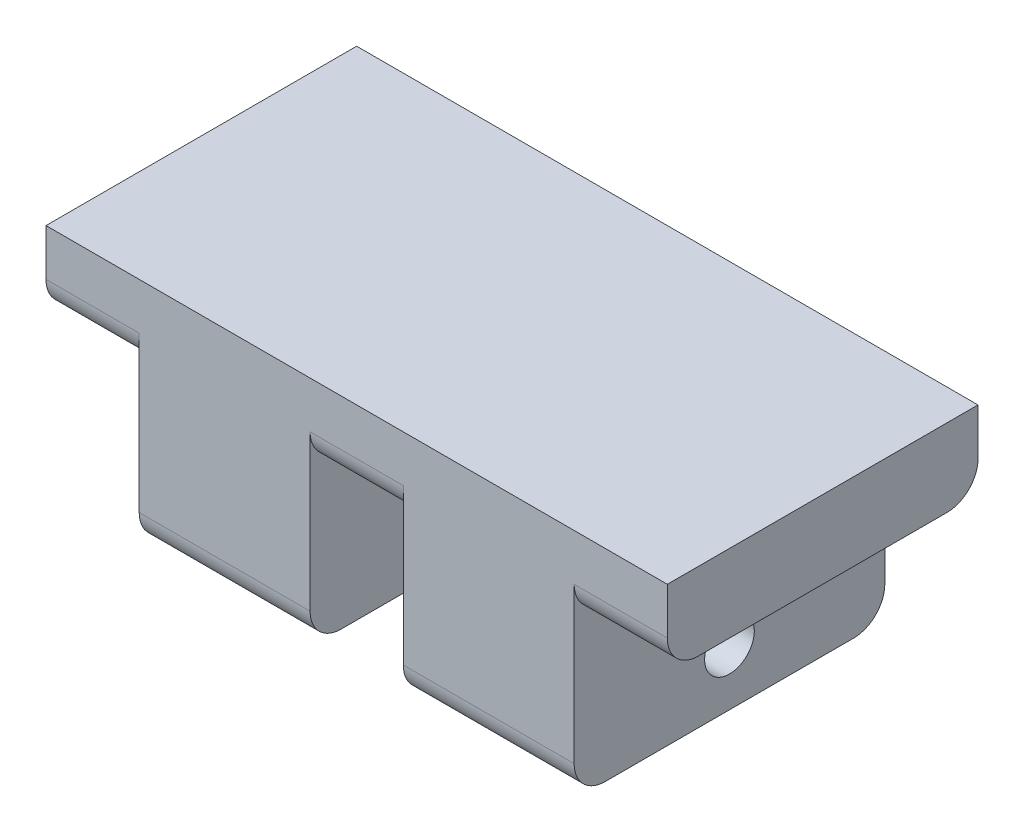
ISO-10303-21;
HEADER;
FILE_DESCRIPTION(('STEP AP214'),'2;1');
FILE_NAME('part.step','',(''),(''),'','','');
FILE_SCHEMA(('AUTOMOTIVE_DESIGN { 1 0 10303 214 1 1 1 1 }'));
ENDSEC;
DATA;
#1=APPLICATION_CONTEXT('core data for automotive mechanical design processes');
#2=APPLICATION_PROTOCOL_DEFINITION('international standard','automotive_design',2000,#1);
#3=PRODUCT_CONTEXT('',#1,'mechanical');
#4=PRODUCT('Part','Part','',(#3));
#5=PRODUCT_RELATED_PRODUCT_CATEGORY('part','',(#4));
#6=PRODUCT_DEFINITION_FORMATION('','',#4);
#7=PRODUCT_DEFINITION_CONTEXT('part definition',#1,'design');
#8=PRODUCT_DEFINITION('design','',#6,#7);
#9=PRODUCT_DEFINITION_SHAPE('','',#8);
#10=(LENGTH_UNIT() NAMED_UNIT(*) SI_UNIT(.MILLI.,.METRE.));
#11=(NAMED_UNIT(*) PLANE_ANGLE_UNIT() SI_UNIT($,.RADIAN.));
#12=(NAMED_UNIT(*) SI_UNIT($,.STERADIAN.) SOLID_ANGLE_UNIT());
#13=UNCERTAINTY_MEASURE_WITH_UNIT(LENGTH_MEASURE(1.E-05),#10,'distance_accuracy_value','');
#14=(GEOMETRIC_REPRESENTATION_CONTEXT(3) GLOBAL_UNCERTAINTY_ASSIGNED_CONTEXT((#13)) GLOBAL_UNIT_ASSIGNED_CONTEXT((#10,
#11,#12)) REPRESENTATION_CONTEXT('',''));
#15=CARTESIAN_POINT('',(0.,0.,0.));
#16=DIRECTION('',(0.,0.,1.));
#17=DIRECTION('',(1.,0.,0.));
#18=AXIS2_PLACEMENT_3D('',#15,#16,#17);
#19=CARTESIAN_POINT('',(13.97,0.,25.4));
#20=DIRECTION('',(0.,1.,0.));
#21=DIRECTION('',(-1.,0.,0.));
#22=AXIS2_PLACEMENT_3D('',#19,#20,#21);
#23=PLANE('',#22);
#24=DIRECTION('',(0.,0.,-1.));
#25=VECTOR('',#24,1.);
#26=CARTESIAN_POINT('',(0.,0.,25.4));
#27=LINE('',#26,#25);
#28=CARTESIAN_POINT('',(0.,0.,22.86));
#29=VERTEX_POINT('',#28);
#30=CARTESIAN_POINT('',(0.,0.,2.54));
#31=VERTEX_POINT('',#30);
#32=EDGE_CURVE('E213',#29,#31,#27,.T.);
#33=ORIENTED_EDGE('',*,*,#32,.T.);
#34=DIRECTION('',(1.,0.,0.));
#35=VECTOR('',#34,1.);
#36=CARTESIAN_POINT('',(13.97,0.,2.54));
#37=LINE('',#36,#35);
#38=CARTESIAN_POINT('',(13.97,0.,2.54));
#39=VERTEX_POINT('',#38);
#40=EDGE_CURVE('E262',#31,#39,#37,.T.);
#41=ORIENTED_EDGE('',*,*,#40,.T.);
#42=DIRECTION('',(0.,0.,-1.));
#43=VECTOR('',#42,1.);
#44=CARTESIAN_POINT('',(13.97,0.,25.4));
#45=LINE('',#44,#43);
#46=CARTESIAN_POINT('',(13.97,0.,22.86));
#47=VERTEX_POINT('',#46);
#48=EDGE_CURVE('E257',#47,#39,#45,.T.);
#49=ORIENTED_EDGE('',*,*,#48,.F.);
#50=DIRECTION('',(1.,0.,0.));
#51=VECTOR('',#50,1.);
#52=CARTESIAN_POINT('',(13.97,0.,22.86));
#53=LINE('',#52,#51);
#54=EDGE_CURVE('E260',#47,#29,#53,.F.);
#55=ORIENTED_EDGE('',*,*,#54,.T.);
#56=EDGE_LOOP('',(#33,#41,#49,#55));
#57=FACE_BOUND('',#56,.T.);
#58=ADVANCED_FACE('F32',(#57),#23,.F.);
#59=CARTESIAN_POINT('',(13.97,12.7,25.4));
#60=DIRECTION('',(-1.,0.,0.));
#61=DIRECTION('',(0.,-1.,0.));
#62=AXIS2_PLACEMENT_3D('',#59,#60,#61);
#63=PLANE('',#62);
#64=CARTESIAN_POINT('',(13.97,4.572,12.7));
#65=DIRECTION('',(-1.,0.,0.));
#66=DIRECTION('',(0.,-1.,0.));
#67=AXIS2_PLACEMENT_3D('',#64,#65,#66);
#68=CIRCLE('',#67,2.03199999999998);
#69=CARTESIAN_POINT('',(13.97,2.54000000000002,12.7));
#70=VERTEX_POINT('',#69);
#71=EDGE_CURVE('E217',#70,#70,#68,.T.);
#72=ORIENTED_EDGE('',*,*,#71,.T.);
#73=EDGE_LOOP('',(#72));
#74=FACE_BOUND('',#73,.T.);
#75=ORIENTED_EDGE('',*,*,#48,.T.);
#76=CARTESIAN_POINT('',(13.97,2.54,2.54));
#77=DIRECTION('',(-1.,0.,0.));
#78=DIRECTION('',(0.,-1.,0.));
#79=AXIS2_PLACEMENT_3D('',#76,#77,#78);
#80=CIRCLE('',#79,2.54);
#81=CARTESIAN_POINT('',(13.97,2.54,0.));
#82=VERTEX_POINT('',#81);
#83=EDGE_CURVE('E267',#39,#82,#80,.F.);
#84=ORIENTED_EDGE('',*,*,#83,.T.);
#85=DIRECTION('',(0.,1.,0.));
#86=VECTOR('',#85,1.);
#87=CARTESIAN_POINT('',(13.97,12.7,0.));
#88=LINE('',#87,#86);
#89=CARTESIAN_POINT('',(13.97,15.24,0.));
#90=VERTEX_POINT('',#89);
#91=EDGE_CURVE('E214',#82,#90,#88,.T.);
#92=ORIENTED_EDGE('',*,*,#91,.T.);
#93=CARTESIAN_POINT('',(13.97,15.24,2.54));
#94=DIRECTION('',(-1.,0.,0.));
#95=DIRECTION('',(0.,-1.,0.));
#96=AXIS2_PLACEMENT_3D('',#93,#94,#95);
#97=CIRCLE('',#96,2.54);
#98=CARTESIAN_POINT('',(13.97,12.7,2.54));
#99=VERTEX_POINT('',#98);
#100=EDGE_CURVE('E344',#90,#99,#97,.T.);
#101=ORIENTED_EDGE('',*,*,#100,.T.);
#102=DIRECTION('',(0.,0.,-1.));
#103=VECTOR('',#102,1.);
#104=CARTESIAN_POINT('',(13.97,12.7,25.4));
#105=LINE('',#104,#103);
#106=CARTESIAN_POINT('',(13.97,12.7,22.86));
#107=VERTEX_POINT('',#106);
#108=EDGE_CURVE('E254',#107,#99,#105,.T.);
#109=ORIENTED_EDGE('',*,*,#108,.F.);
#110=CARTESIAN_POINT('',(13.97,15.24,22.86));
#111=DIRECTION('',(-1.,0.,0.));
#112=DIRECTION('',(0.,-1.,0.));
#113=AXIS2_PLACEMENT_3D('',#110,#111,#112);
#114=CIRCLE('',#113,2.54);
#115=CARTESIAN_POINT('',(13.97,15.24,25.4));
#116=VERTEX_POINT('',#115);
#117=EDGE_CURVE('E40',#107,#116,#114,.T.);
#118=ORIENTED_EDGE('',*,*,#117,.T.);
#119=DIRECTION('',(0.,1.,0.));
#120=VECTOR('',#119,1.);
#121=CARTESIAN_POINT('',(13.97,12.7,25.4));
#122=LINE('',#121,#120);
#123=CARTESIAN_POINT('',(13.97,2.54,25.4));
#124=VERTEX_POINT('',#123);
#125=EDGE_CURVE('E231',#124,#116,#122,.T.);
#126=ORIENTED_EDGE('',*,*,#125,.F.);
#127=CARTESIAN_POINT('',(13.97,2.54,22.86));
#128=DIRECTION('',(-1.,0.,0.));
#129=DIRECTION('',(0.,-1.,0.));
#130=AXIS2_PLACEMENT_3D('',#127,#128,#129);
#131=CIRCLE('',#130,2.54);
#132=EDGE_CURVE('E265',#124,#47,#131,.F.);
#133=ORIENTED_EDGE('',*,*,#132,.T.);
#134=EDGE_LOOP('',(#75,#84,#92,#101,#109,#118,#126,#133));
#135=FACE_BOUND('',#134,.T.);
#136=ADVANCED_FACE('F357',(#74,#135),#63,.F.);
#137=CARTESIAN_POINT('',(21.59,12.7,25.4));
#138=DIRECTION('',(0.,1.,0.));
#139=DIRECTION('',(-1.,0.,0.));
#140=AXIS2_PLACEMENT_3D('',#137,#138,#139);
#141=PLANE('',#140);
#142=ORIENTED_EDGE('',*,*,#108,.T.);
#143=DIRECTION('',(1.,0.,0.));
#144=VECTOR('',#143,1.);
#145=CARTESIAN_POINT('',(21.59,12.7,2.54));
#146=LINE('',#145,#144);
#147=CARTESIAN_POINT('',(21.59,12.7,2.54));
#148=VERTEX_POINT('',#147);
#149=EDGE_CURVE('E319',#99,#148,#146,.T.);
#150=ORIENTED_EDGE('',*,*,#149,.T.);
#151=DIRECTION('',(0.,0.,-1.));
#152=VECTOR('',#151,1.);
#153=CARTESIAN_POINT('',(21.59,12.7,25.4));
#154=LINE('',#153,#152);
#155=CARTESIAN_POINT('',(21.59,12.7,22.86));
#156=VERTEX_POINT('',#155);
#157=EDGE_CURVE('E251',#156,#148,#154,.T.);
#158=ORIENTED_EDGE('',*,*,#157,.F.);
#159=DIRECTION('',(1.,0.,0.));
#160=VECTOR('',#159,1.);
#161=CARTESIAN_POINT('',(21.59,12.7,22.86));
#162=LINE('',#161,#160);
#163=EDGE_CURVE('E317',#156,#107,#162,.F.);
#164=ORIENTED_EDGE('',*,*,#163,.T.);
#165=EDGE_LOOP('',(#142,#150,#158,#164));
#166=FACE_BOUND('',#165,.T.);
#167=ADVANCED_FACE('F449',(#166),#141,.F.);
#168=CARTESIAN_POINT('',(21.59,0.,25.4));
#169=DIRECTION('',(1.,0.,0.));
#170=DIRECTION('',(0.,0.,-1.));
#171=AXIS2_PLACEMENT_3D('',#168,#169,#170);
#172=PLANE('',#171);
#173=CARTESIAN_POINT('',(21.59,4.572,12.7));
#174=DIRECTION('',(1.,0.,0.));
#175=DIRECTION('',(0.,0.,-1.));
#176=AXIS2_PLACEMENT_3D('',#173,#174,#175);
#177=CIRCLE('',#176,2.03199999999998);
#178=CARTESIAN_POINT('',(21.59,4.572,10.668));
#179=VERTEX_POINT('',#178);
#180=EDGE_CURVE('E299',#179,#179,#177,.T.);
#181=ORIENTED_EDGE('',*,*,#180,.T.);
#182=EDGE_LOOP('',(#181));
#183=FACE_BOUND('',#182,.T.);
#184=DIRECTION('',(0.,-1.,0.));
#185=VECTOR('',#184,1.);
#186=CARTESIAN_POINT('',(21.59,0.,0.));
#187=LINE('',#186,#185);
#188=CARTESIAN_POINT('',(21.59,15.24,0.));
#189=VERTEX_POINT('',#188);
#190=CARTESIAN_POINT('',(21.59,2.54,0.));
#191=VERTEX_POINT('',#190);
#192=EDGE_CURVE('E216',#189,#191,#187,.T.);
#193=ORIENTED_EDGE('',*,*,#192,.T.);
#194=CARTESIAN_POINT('',(21.59,2.54,2.54));
#195=DIRECTION('',(1.,0.,0.));
#196=DIRECTION('',(0.,0.,-1.));
#197=AXIS2_PLACEMENT_3D('',#194,#195,#196);
#198=CIRCLE('',#197,2.54);
#199=CARTESIAN_POINT('',(21.59,0.,2.54));
#200=VERTEX_POINT('',#199);
#201=EDGE_CURVE('E288',#191,#200,#198,.F.);
#202=ORIENTED_EDGE('',*,*,#201,.T.);
#203=DIRECTION('',(0.,0.,-1.));
#204=VECTOR('',#203,1.);
#205=CARTESIAN_POINT('',(21.59,0.,25.4));
#206=LINE('',#205,#204);
#207=CARTESIAN_POINT('',(21.59,0.,22.86));
#208=VERTEX_POINT('',#207);
#209=EDGE_CURVE('E248',#208,#200,#206,.T.);
#210=ORIENTED_EDGE('',*,*,#209,.F.);
#211=CARTESIAN_POINT('',(21.59,2.54,22.86));
#212=DIRECTION('',(1.,0.,0.));
#213=DIRECTION('',(0.,0.,-1.));
#214=AXIS2_PLACEMENT_3D('',#211,#212,#213);
#215=CIRCLE('',#214,2.54);
#216=CARTESIAN_POINT('',(21.59,2.54,25.4));
#217=VERTEX_POINT('',#216);
#218=EDGE_CURVE('E286',#208,#217,#215,.F.);
#219=ORIENTED_EDGE('',*,*,#218,.T.);
#220=DIRECTION('',(0.,-1.,0.));
#221=VECTOR('',#220,1.);
#222=CARTESIAN_POINT('',(21.59,0.,25.4));
#223=LINE('',#222,#221);
#224=CARTESIAN_POINT('',(21.59,15.24,25.4));
#225=VERTEX_POINT('',#224);
#226=EDGE_CURVE('E55',#225,#217,#223,.T.);
#227=ORIENTED_EDGE('',*,*,#226,.F.);
#228=CARTESIAN_POINT('',(21.59,15.24,22.86));
#229=DIRECTION('',(1.,0.,0.));
#230=DIRECTION('',(0.,0.,-1.));
#231=AXIS2_PLACEMENT_3D('',#228,#229,#230);
#232=CIRCLE('',#231,2.54);
#233=EDGE_CURVE('E350',#225,#156,#232,.T.);
#234=ORIENTED_EDGE('',*,*,#233,.T.);
#235=ORIENTED_EDGE('',*,*,#157,.T.);
#236=CARTESIAN_POINT('',(21.59,15.24,2.54));
#237=DIRECTION('',(1.,0.,0.));
#238=DIRECTION('',(0.,0.,-1.));
#239=AXIS2_PLACEMENT_3D('',#236,#237,#238);
#240=CIRCLE('',#239,2.54);
#241=EDGE_CURVE('E341',#148,#189,#240,.T.);
#242=ORIENTED_EDGE('',*,*,#241,.T.);
#243=EDGE_LOOP('',(#193,#202,#210,#219,#227,#234,#235,#242));
#244=FACE_BOUND('',#243,.T.);
#245=ADVANCED_FACE('F391',(#183,#244),#172,.F.);
#246=CARTESIAN_POINT('',(35.56,0.,25.4));
#247=DIRECTION('',(0.,1.,0.));
#248=DIRECTION('',(-1.,0.,0.));
#249=AXIS2_PLACEMENT_3D('',#246,#247,#248);
#250=PLANE('',#249);
#251=ORIENTED_EDGE('',*,*,#209,.T.);
#252=DIRECTION('',(1.,0.,0.));
#253=VECTOR('',#252,1.);
#254=CARTESIAN_POINT('',(35.56,0.,2.54));
#255=LINE('',#254,#253);
#256=CARTESIAN_POINT('',(35.56,0.,2.54));
#257=VERTEX_POINT('',#256);
#258=EDGE_CURVE('E279',#200,#257,#255,.T.);
#259=ORIENTED_EDGE('',*,*,#258,.T.);
#260=DIRECTION('',(0.,0.,-1.));
#261=VECTOR('',#260,1.);
#262=CARTESIAN_POINT('',(35.56,0.,25.4));
#263=LINE('',#262,#261);
#264=CARTESIAN_POINT('',(35.56,0.,22.86));
#265=VERTEX_POINT('',#264);
#266=EDGE_CURVE('E245',#265,#257,#263,.T.);
#267=ORIENTED_EDGE('',*,*,#266,.F.);
#268=DIRECTION('',(1.,0.,0.));
#269=VECTOR('',#268,1.);
#270=CARTESIAN_POINT('',(35.56,0.,22.86));
#271=LINE('',#270,#269);
#272=EDGE_CURVE('E277',#265,#208,#271,.F.);
#273=ORIENTED_EDGE('',*,*,#272,.T.);
#274=EDGE_LOOP('',(#251,#259,#267,#273));
#275=FACE_BOUND('',#274,.T.);
#276=ADVANCED_FACE('F380',(#275),#250,.F.);
#277=CARTESIAN_POINT('',(35.56,12.7,25.4));
#278=DIRECTION('',(-1.,0.,0.));
#279=DIRECTION('',(0.,0.,1.));
#280=AXIS2_PLACEMENT_3D('',#277,#278,#279);
#281=PLANE('',#280);
#282=CARTESIAN_POINT('',(35.56,4.572,12.7));
#283=DIRECTION('',(1.,0.,0.));
#284=DIRECTION('',(0.,0.,-1.));
#285=AXIS2_PLACEMENT_3D('',#282,#283,#284);
#286=CIRCLE('',#285,2.03199999999998);
#287=CARTESIAN_POINT('',(35.56,4.572,10.668));
#288=VERTEX_POINT('',#287);
#289=EDGE_CURVE('E300',#288,#288,#286,.T.);
#290=ORIENTED_EDGE('',*,*,#289,.F.);
#291=EDGE_LOOP('',(#290));
#292=FACE_BOUND('',#291,.T.);
#293=ORIENTED_EDGE('',*,*,#266,.T.);
#294=CARTESIAN_POINT('',(35.56,2.54,2.54));
#295=DIRECTION('',(-1.,0.,0.));
#296=DIRECTION('',(0.,0.,1.));
#297=AXIS2_PLACEMENT_3D('',#294,#295,#296);
#298=CIRCLE('',#297,2.54);
#299=CARTESIAN_POINT('',(35.56,2.54,0.));
#300=VERTEX_POINT('',#299);
#301=EDGE_CURVE('E284',#257,#300,#298,.F.);
#302=ORIENTED_EDGE('',*,*,#301,.T.);
#303=DIRECTION('',(0.,1.,0.));
#304=VECTOR('',#303,1.);
#305=CARTESIAN_POINT('',(35.56,12.7,0.));
#306=LINE('',#305,#304);
#307=CARTESIAN_POINT('',(35.56,15.24,0.));
#308=VERTEX_POINT('',#307);
#309=EDGE_CURVE('E220',#300,#308,#306,.T.);
#310=ORIENTED_EDGE('',*,*,#309,.T.);
#311=CARTESIAN_POINT('',(35.56,15.24,2.54));
#312=DIRECTION('',(-1.,0.,0.));
#313=DIRECTION('',(0.,0.,1.));
#314=AXIS2_PLACEMENT_3D('',#311,#312,#313);
#315=CIRCLE('',#314,2.54);
#316=CARTESIAN_POINT('',(35.56,12.7,2.54));
#317=VERTEX_POINT('',#316);
#318=EDGE_CURVE('E346',#308,#317,#315,.T.);
#319=ORIENTED_EDGE('',*,*,#318,.T.);
#320=DIRECTION('',(0.,0.,-1.));
#321=VECTOR('',#320,1.);
#322=CARTESIAN_POINT('',(35.56,12.7,25.4));
#323=LINE('',#322,#321);
#324=CARTESIAN_POINT('',(35.56,12.7,22.86));
#325=VERTEX_POINT('',#324);
#326=EDGE_CURVE('E242',#325,#317,#323,.T.);
#327=ORIENTED_EDGE('',*,*,#326,.F.);
#328=CARTESIAN_POINT('',(35.56,15.24,22.86));
#329=DIRECTION('',(-1.,0.,0.));
#330=DIRECTION('',(0.,0.,1.));
#331=AXIS2_PLACEMENT_3D('',#328,#329,#330);
#332=CIRCLE('',#331,2.54);
#333=CARTESIAN_POINT('',(35.56,15.24,25.4));
#334=VERTEX_POINT('',#333);
#335=EDGE_CURVE('E348',#325,#334,#332,.T.);
#336=ORIENTED_EDGE('',*,*,#335,.T.);
#337=DIRECTION('',(0.,1.,0.));
#338=VECTOR('',#337,1.);
#339=CARTESIAN_POINT('',(35.56,12.7,25.4));
#340=LINE('',#339,#338);
#341=CARTESIAN_POINT('',(35.56,2.54,25.4));
#342=VERTEX_POINT('',#341);
#343=EDGE_CURVE('E47',#342,#334,#340,.T.);
#344=ORIENTED_EDGE('',*,*,#343,.F.);
#345=CARTESIAN_POINT('',(35.56,2.54,22.86));
#346=DIRECTION('',(-1.,0.,0.));
#347=DIRECTION('',(0.,0.,1.));
#348=AXIS2_PLACEMENT_3D('',#345,#346,#347);
#349=CIRCLE('',#348,2.54);
#350=EDGE_CURVE('E282',#342,#265,#349,.F.);
#351=ORIENTED_EDGE('',*,*,#350,.T.);
#352=EDGE_LOOP('',(#293,#302,#310,#319,#327,#336,#344,#351));
#353=FACE_BOUND('',#352,.T.);
#354=ADVANCED_FACE('F376',(#292,#353),#281,.F.);
#355=CARTESIAN_POINT('',(43.18,12.7,25.4));
#356=DIRECTION('',(0.,1.,0.));
#357=DIRECTION('',(-1.,0.,0.));
#358=AXIS2_PLACEMENT_3D('',#355,#356,#357);
#359=PLANE('',#358);
#360=ORIENTED_EDGE('',*,*,#326,.T.);
#361=DIRECTION('',(1.,0.,0.));
#362=VECTOR('',#361,1.);
#363=CARTESIAN_POINT('',(43.18,12.7,2.54));
#364=LINE('',#363,#362);
#365=CARTESIAN_POINT('',(43.18,12.7,2.54));
#366=VERTEX_POINT('',#365);
#367=EDGE_CURVE('E324',#317,#366,#364,.T.);
#368=ORIENTED_EDGE('',*,*,#367,.T.);
#369=DIRECTION('',(0.,0.,-1.));
#370=VECTOR('',#369,1.);
#371=CARTESIAN_POINT('',(43.18,12.7,25.4));
#372=LINE('',#371,#370);
#373=CARTESIAN_POINT('',(43.18,12.7,22.86));
#374=VERTEX_POINT('',#373);
#375=EDGE_CURVE('E199',#374,#366,#372,.T.);
#376=ORIENTED_EDGE('',*,*,#375,.F.);
#377=DIRECTION('',(1.,0.,0.));
#378=VECTOR('',#377,1.);
#379=CARTESIAN_POINT('',(43.18,12.7,22.86));
#380=LINE('',#379,#378);
#381=EDGE_CURVE('E322',#374,#325,#380,.F.);
#382=ORIENTED_EDGE('',*,*,#381,.T.);
#383=EDGE_LOOP('',(#360,#368,#376,#382));
#384=FACE_BOUND('',#383,.T.);
#385=ADVANCED_FACE('F379',(#384),#359,.F.);
#386=CARTESIAN_POINT('',(43.18,19.05,25.4));
#387=DIRECTION('',(-1.,0.,0.));
#388=DIRECTION('',(0.,0.,1.));
#389=AXIS2_PLACEMENT_3D('',#386,#387,#388);
#390=PLANE('',#389);
#391=ORIENTED_EDGE('',*,*,#375,.T.);
#392=CARTESIAN_POINT('',(43.18,15.24,2.54));
#393=DIRECTION('',(-1.,0.,0.));
#394=DIRECTION('',(0.,0.,1.));
#395=AXIS2_PLACEMENT_3D('',#392,#393,#394);
#396=CIRCLE('',#395,2.54);
#397=CARTESIAN_POINT('',(43.18,15.24,0.));
#398=VERTEX_POINT('',#397);
#399=EDGE_CURVE('E329',#366,#398,#396,.F.);
#400=ORIENTED_EDGE('',*,*,#399,.T.);
#401=DIRECTION('',(0.,1.,0.));
#402=VECTOR('',#401,1.);
#403=CARTESIAN_POINT('',(43.18,19.05,0.));
#404=LINE('',#403,#402);
#405=CARTESIAN_POINT('',(43.18,19.05,0.));
#406=VERTEX_POINT('',#405);
#407=EDGE_CURVE('E196',#398,#406,#404,.T.);
#408=ORIENTED_EDGE('',*,*,#407,.T.);
#409=DIRECTION('',(0.,0.,-1.));
#410=VECTOR('',#409,1.);
#411=CARTESIAN_POINT('',(43.18,19.05,25.4));
#412=LINE('',#411,#410);
#413=CARTESIAN_POINT('',(43.18,19.05,25.4));
#414=VERTEX_POINT('',#413);
#415=EDGE_CURVE('E192',#414,#406,#412,.T.);
#416=ORIENTED_EDGE('',*,*,#415,.F.);
#417=DIRECTION('',(0.,1.,0.));
#418=VECTOR('',#417,1.);
#419=CARTESIAN_POINT('',(43.18,19.05,25.4));
#420=LINE('',#419,#418);
#421=CARTESIAN_POINT('',(43.18,15.24,25.4));
#422=VERTEX_POINT('',#421);
#423=EDGE_CURVE('E180',#422,#414,#420,.T.);
#424=ORIENTED_EDGE('',*,*,#423,.F.);
#425=CARTESIAN_POINT('',(43.18,15.24,22.86));
#426=DIRECTION('',(-1.,0.,0.));
#427=DIRECTION('',(0.,0.,1.));
#428=AXIS2_PLACEMENT_3D('',#425,#426,#427);
#429=CIRCLE('',#428,2.54);
#430=EDGE_CURVE('E327',#422,#374,#429,.F.);
#431=ORIENTED_EDGE('',*,*,#430,.T.);
#432=EDGE_LOOP('',(#391,#400,#408,#416,#424,#431));
#433=FACE_BOUND('',#432,.T.);
#434=ADVANCED_FACE('F194',(#433),#390,.F.);
#435=CARTESIAN_POINT('',(-7.62,19.05,25.4));
#436=DIRECTION('',(0.,-1.,0.));
#437=DIRECTION('',(0.,0.,-1.));
#438=AXIS2_PLACEMENT_3D('',#435,#436,#437);
#439=PLANE('',#438);
#440=DIRECTION('',(-1.,0.,0.));
#441=VECTOR('',#440,1.);
#442=CARTESIAN_POINT('',(-7.62,19.05,0.));
#443=LINE('',#442,#441);
#444=CARTESIAN_POINT('',(-7.62,19.05,0.));
#445=VERTEX_POINT('',#444);
#446=EDGE_CURVE('E223',#406,#445,#443,.T.);
#447=ORIENTED_EDGE('',*,*,#446,.T.);
#448=DIRECTION('',(0.,0.,-1.));
#449=VECTOR('',#448,1.);
#450=CARTESIAN_POINT('',(-7.62,19.05,25.4));
#451=LINE('',#450,#449);
#452=CARTESIAN_POINT('',(-7.62,19.05,25.4));
#453=VERTEX_POINT('',#452);
#454=EDGE_CURVE('E200',#453,#445,#451,.T.);
#455=ORIENTED_EDGE('',*,*,#454,.F.);
#456=DIRECTION('',(-1.,0.,0.));
#457=VECTOR('',#456,1.);
#458=CARTESIAN_POINT('',(-7.62,19.05,25.4));
#459=LINE('',#458,#457);
#460=EDGE_CURVE('E185',#414,#453,#459,.T.);
#461=ORIENTED_EDGE('',*,*,#460,.F.);
#462=ORIENTED_EDGE('',*,*,#415,.T.);
#463=EDGE_LOOP('',(#447,#455,#461,#462));
#464=FACE_BOUND('',#463,.T.);
#465=ADVANCED_FACE('F202',(#464),#439,.F.);
#466=CARTESIAN_POINT('',(-7.62,12.7,25.4));
#467=DIRECTION('',(1.,0.,0.));
#468=DIRECTION('',(0.,0.,-1.));
#469=AXIS2_PLACEMENT_3D('',#466,#467,#468);
#470=PLANE('',#469);
#471=DIRECTION('',(0.,-1.,0.));
#472=VECTOR('',#471,1.);
#473=CARTESIAN_POINT('',(-7.62,12.7,0.));
#474=LINE('',#473,#472);
#475=CARTESIAN_POINT('',(-7.62,15.24,0.));
#476=VERTEX_POINT('',#475);
#477=EDGE_CURVE('E225',#445,#476,#474,.T.);
#478=ORIENTED_EDGE('',*,*,#477,.T.);
#479=CARTESIAN_POINT('',(-7.62,15.24,2.54));
#480=DIRECTION('',(1.,0.,0.));
#481=DIRECTION('',(0.,0.,-1.));
#482=AXIS2_PLACEMENT_3D('',#479,#480,#481);
#483=CIRCLE('',#482,2.54);
#484=CARTESIAN_POINT('',(-7.62,12.7,2.54));
#485=VERTEX_POINT('',#484);
#486=EDGE_CURVE('E315',#476,#485,#483,.F.);
#487=ORIENTED_EDGE('',*,*,#486,.T.);
#488=DIRECTION('',(0.,0.,-1.));
#489=VECTOR('',#488,1.);
#490=CARTESIAN_POINT('',(-7.62,12.7,25.4));
#491=LINE('',#490,#489);
#492=CARTESIAN_POINT('',(-7.62,12.7,22.86));
#493=VERTEX_POINT('',#492);
#494=EDGE_CURVE('E237',#493,#485,#491,.T.);
#495=ORIENTED_EDGE('',*,*,#494,.F.);
#496=CARTESIAN_POINT('',(-7.62,15.24,22.86));
#497=DIRECTION('',(1.,0.,0.));
#498=DIRECTION('',(0.,0.,-1.));
#499=AXIS2_PLACEMENT_3D('',#496,#497,#498);
#500=CIRCLE('',#499,2.54);
#501=CARTESIAN_POINT('',(-7.62,15.24,25.4));
#502=VERTEX_POINT('',#501);
#503=EDGE_CURVE('E313',#493,#502,#500,.F.);
#504=ORIENTED_EDGE('',*,*,#503,.T.);
#505=DIRECTION('',(0.,-1.,0.));
#506=VECTOR('',#505,1.);
#507=CARTESIAN_POINT('',(-7.62,12.7,25.4));
#508=LINE('',#507,#506);
#509=EDGE_CURVE('E205',#453,#502,#508,.T.);
#510=ORIENTED_EDGE('',*,*,#509,.F.);
#511=ORIENTED_EDGE('',*,*,#454,.T.);
#512=EDGE_LOOP('',(#478,#487,#495,#504,#510,#511));
#513=FACE_BOUND('',#512,.T.);
#514=ADVANCED_FACE('F435',(#513),#470,.F.);
#515=CARTESIAN_POINT('',(0.,12.7,25.4));
#516=DIRECTION('',(0.,1.,0.));
#517=DIRECTION('',(-1.,0.,0.));
#518=AXIS2_PLACEMENT_3D('',#515,#516,#517);
#519=PLANE('',#518);
#520=ORIENTED_EDGE('',*,*,#494,.T.);
#521=DIRECTION('',(1.,0.,0.));
#522=VECTOR('',#521,1.);
#523=CARTESIAN_POINT('',(0.,12.7,2.54));
#524=LINE('',#523,#522);
#525=CARTESIAN_POINT('',(0.,12.7,2.54));
#526=VERTEX_POINT('',#525);
#527=EDGE_CURVE('E302',#485,#526,#524,.T.);
#528=ORIENTED_EDGE('',*,*,#527,.T.);
#529=DIRECTION('',(0.,0.,-1.));
#530=VECTOR('',#529,1.);
#531=CARTESIAN_POINT('',(0.,12.7,25.4));
#532=LINE('',#531,#530);
#533=CARTESIAN_POINT('',(0.,12.7,22.86));
#534=VERTEX_POINT('',#533);
#535=EDGE_CURVE('E234',#534,#526,#532,.T.);
#536=ORIENTED_EDGE('',*,*,#535,.F.);
#537=DIRECTION('',(1.,0.,0.));
#538=VECTOR('',#537,1.);
#539=CARTESIAN_POINT('',(0.,12.7,22.86));
#540=LINE('',#539,#538);
#541=EDGE_CURVE('E295',#534,#493,#540,.F.);
#542=ORIENTED_EDGE('',*,*,#541,.T.);
#543=EDGE_LOOP('',(#520,#528,#536,#542));
#544=FACE_BOUND('',#543,.T.);
#545=ADVANCED_FACE('F426',(#544),#519,.F.);
#546=CARTESIAN_POINT('',(0.,0.,25.4));
#547=DIRECTION('',(1.,0.,0.));
#548=DIRECTION('',(0.,0.,-1.));
#549=AXIS2_PLACEMENT_3D('',#546,#547,#548);
#550=PLANE('',#549);
#551=CARTESIAN_POINT('',(0.,4.572,12.7));
#552=DIRECTION('',(1.,0.,0.));
#553=DIRECTION('',(0.,0.,-1.));
#554=AXIS2_PLACEMENT_3D('',#551,#552,#553);
#555=CIRCLE('',#554,2.03199999999998);
#556=CARTESIAN_POINT('',(0.,4.572,10.668));
#557=VERTEX_POINT('',#556);
#558=EDGE_CURVE('E296',#557,#557,#555,.T.);
#559=ORIENTED_EDGE('',*,*,#558,.T.);
#560=EDGE_LOOP('',(#559));
#561=FACE_BOUND('',#560,.T.);
#562=DIRECTION('',(0.,-1.,0.));
#563=VECTOR('',#562,1.);
#564=CARTESIAN_POINT('',(0.,0.,0.));
#565=LINE('',#564,#563);
#566=CARTESIAN_POINT('',(0.,15.24,0.));
#567=VERTEX_POINT('',#566);
#568=CARTESIAN_POINT('',(0.,2.54,0.));
#569=VERTEX_POINT('',#568);
#570=EDGE_CURVE('E228',#567,#569,#565,.T.);
#571=ORIENTED_EDGE('',*,*,#570,.T.);
#572=CARTESIAN_POINT('',(0.,2.54,2.54));
#573=DIRECTION('',(1.,0.,0.));
#574=DIRECTION('',(0.,0.,-1.));
#575=AXIS2_PLACEMENT_3D('',#572,#573,#574);
#576=CIRCLE('',#575,2.54);
#577=EDGE_CURVE('E275',#569,#31,#576,.F.);
#578=ORIENTED_EDGE('',*,*,#577,.T.);
#579=ORIENTED_EDGE('',*,*,#32,.F.);
#580=CARTESIAN_POINT('',(0.,2.54,22.86));
#581=DIRECTION('',(1.,0.,0.));
#582=DIRECTION('',(0.,0.,-1.));
#583=AXIS2_PLACEMENT_3D('',#580,#581,#582);
#584=CIRCLE('',#583,2.54);
#585=CARTESIAN_POINT('',(0.,2.54,25.4));
#586=VERTEX_POINT('',#585);
#587=EDGE_CURVE('E273',#29,#586,#584,.F.);
#588=ORIENTED_EDGE('',*,*,#587,.T.);
#589=DIRECTION('',(0.,-1.,0.));
#590=VECTOR('',#589,1.);
#591=CARTESIAN_POINT('',(0.,0.,25.4));
#592=LINE('',#591,#590);
#593=CARTESIAN_POINT('',(0.,15.24,25.4));
#594=VERTEX_POINT('',#593);
#595=EDGE_CURVE('E207',#594,#586,#592,.T.);
#596=ORIENTED_EDGE('',*,*,#595,.F.);
#597=CARTESIAN_POINT('',(0.,15.24,22.86));
#598=DIRECTION('',(1.,0.,0.));
#599=DIRECTION('',(0.,0.,-1.));
#600=AXIS2_PLACEMENT_3D('',#597,#598,#599);
#601=CIRCLE('',#600,2.54);
#602=EDGE_CURVE('E11',#594,#534,#601,.T.);
#603=ORIENTED_EDGE('',*,*,#602,.T.);
#604=ORIENTED_EDGE('',*,*,#535,.T.);
#605=CARTESIAN_POINT('',(0.,15.24,2.54));
#606=DIRECTION('',(1.,0.,0.));
#607=DIRECTION('',(0.,0.,-1.));
#608=AXIS2_PLACEMENT_3D('',#605,#606,#607);
#609=CIRCLE('',#608,2.54);
#610=EDGE_CURVE('E338',#526,#567,#609,.T.);
#611=ORIENTED_EDGE('',*,*,#610,.T.);
#612=EDGE_LOOP('',(#571,#578,#579,#588,#596,#603,#604,#611));
#613=FACE_BOUND('',#612,.T.);
#614=ADVANCED_FACE('F412',(#561,#613),#550,.F.);
#615=CARTESIAN_POINT('',(0.,0.,25.4));
#616=DIRECTION('',(0.,0.,-1.));
#617=DIRECTION('',(-1.,0.,0.));
#618=AXIS2_PLACEMENT_3D('',#615,#616,#617);
#619=PLANE('',#618);
#620=ORIENTED_EDGE('',*,*,#343,.T.);
#621=DIRECTION('',(1.,0.,0.));
#622=VECTOR('',#621,1.);
#623=CARTESIAN_POINT('',(0.,15.24,25.4));
#624=LINE('',#623,#622);
#625=EDGE_CURVE('E188',#334,#422,#624,.T.);
#626=ORIENTED_EDGE('',*,*,#625,.T.);
#627=ORIENTED_EDGE('',*,*,#423,.T.);
#628=ORIENTED_EDGE('',*,*,#460,.T.);
#629=ORIENTED_EDGE('',*,*,#509,.T.);
#630=DIRECTION('',(1.,0.,0.));
#631=VECTOR('',#630,1.);
#632=CARTESIAN_POINT('',(0.,15.24,25.4));
#633=LINE('',#632,#631);
#634=EDGE_CURVE('E331',#502,#594,#633,.T.);
#635=ORIENTED_EDGE('',*,*,#634,.T.);
#636=ORIENTED_EDGE('',*,*,#595,.T.);
#637=DIRECTION('',(1.,0.,0.));
#638=VECTOR('',#637,1.);
#639=CARTESIAN_POINT('',(0.,2.54,25.4));
#640=LINE('',#639,#638);
#641=EDGE_CURVE('E290',#586,#124,#640,.T.);
#642=ORIENTED_EDGE('',*,*,#641,.T.);
#643=ORIENTED_EDGE('',*,*,#125,.T.);
#644=DIRECTION('',(1.,0.,0.));
#645=VECTOR('',#644,1.);
#646=CARTESIAN_POINT('',(0.,15.24,25.4));
#647=LINE('',#646,#645);
#648=EDGE_CURVE('E334',#116,#225,#647,.T.);
#649=ORIENTED_EDGE('',*,*,#648,.T.);
#650=ORIENTED_EDGE('',*,*,#226,.T.);
#651=DIRECTION('',(1.,0.,0.));
#652=VECTOR('',#651,1.);
#653=CARTESIAN_POINT('',(0.,2.54,25.4));
#654=LINE('',#653,#652);
#655=EDGE_CURVE('E293',#217,#342,#654,.T.);
#656=ORIENTED_EDGE('',*,*,#655,.T.);
#657=EDGE_LOOP('',(#620,#626,#627,#628,#629,#635,#636,#642,#643,#649,#650,#656));
#658=FACE_BOUND('',#657,.T.);
#659=ADVANCED_FACE('F182',(#658),#619,.F.);
#660=CARTESIAN_POINT('',(0.,0.,0.));
#661=DIRECTION('',(0.,0.,-1.));
#662=DIRECTION('',(-1.,0.,0.));
#663=AXIS2_PLACEMENT_3D('',#660,#661,#662);
#664=PLANE('',#663);
#665=ORIENTED_EDGE('',*,*,#570,.F.);
#666=DIRECTION('',(1.,0.,0.));
#667=VECTOR('',#666,1.);
#668=CARTESIAN_POINT('',(-7.62,15.24,0.));
#669=LINE('',#668,#667);
#670=EDGE_CURVE('E311',#567,#476,#669,.F.);
#671=ORIENTED_EDGE('',*,*,#670,.T.);
#672=ORIENTED_EDGE('',*,*,#477,.F.);
#673=ORIENTED_EDGE('',*,*,#446,.F.);
#674=ORIENTED_EDGE('',*,*,#407,.F.);
#675=DIRECTION('',(1.,0.,0.));
#676=VECTOR('',#675,1.);
#677=CARTESIAN_POINT('',(35.56,15.24,0.));
#678=LINE('',#677,#676);
#679=EDGE_CURVE('E305',#398,#308,#678,.F.);
#680=ORIENTED_EDGE('',*,*,#679,.T.);
#681=ORIENTED_EDGE('',*,*,#309,.F.);
#682=DIRECTION('',(1.,0.,0.));
#683=VECTOR('',#682,1.);
#684=CARTESIAN_POINT('',(21.59,2.54,0.));
#685=LINE('',#684,#683);
#686=EDGE_CURVE('E269',#300,#191,#685,.F.);
#687=ORIENTED_EDGE('',*,*,#686,.T.);
#688=ORIENTED_EDGE('',*,*,#192,.F.);
#689=DIRECTION('',(1.,0.,0.));
#690=VECTOR('',#689,1.);
#691=CARTESIAN_POINT('',(13.97,15.24,0.));
#692=LINE('',#691,#690);
#693=EDGE_CURVE('E308',#189,#90,#692,.F.);
#694=ORIENTED_EDGE('',*,*,#693,.T.);
#695=ORIENTED_EDGE('',*,*,#91,.F.);
#696=DIRECTION('',(1.,0.,0.));
#697=VECTOR('',#696,1.);
#698=CARTESIAN_POINT('',(0.,2.54,0.));
#699=LINE('',#698,#697);
#700=EDGE_CURVE('E271',#82,#569,#699,.F.);
#701=ORIENTED_EDGE('',*,*,#700,.T.);
#702=EDGE_LOOP('',(#665,#671,#672,#673,#674,#680,#681,#687,#688,#694,#695,#701));
#703=FACE_BOUND('',#702,.T.);
#704=ADVANCED_FACE('F397',(#703),#664,.T.);
#705=CARTESIAN_POINT('',(13.97,2.54,2.54));
#706=DIRECTION('',(-1.,0.,0.));
#707=DIRECTION('',(0.,-1.,0.));
#708=AXIS2_PLACEMENT_3D('',#705,#706,#707);
#709=CYLINDRICAL_SURFACE('',#708,2.54);
#710=ORIENTED_EDGE('',*,*,#577,.F.);
#711=ORIENTED_EDGE('',*,*,#700,.F.);
#712=ORIENTED_EDGE('',*,*,#83,.F.);
#713=ORIENTED_EDGE('',*,*,#40,.F.);
#714=EDGE_LOOP('',(#710,#711,#712,#713));
#715=FACE_BOUND('',#714,.T.);
#716=ADVANCED_FACE('F408',(#715),#709,.T.);
#717=CARTESIAN_POINT('',(35.56,2.54,2.54));
#718=DIRECTION('',(-1.,0.,0.));
#719=DIRECTION('',(0.,-1.,0.));
#720=AXIS2_PLACEMENT_3D('',#717,#718,#719);
#721=CYLINDRICAL_SURFACE('',#720,2.54);
#722=ORIENTED_EDGE('',*,*,#201,.F.);
#723=ORIENTED_EDGE('',*,*,#686,.F.);
#724=ORIENTED_EDGE('',*,*,#301,.F.);
#725=ORIENTED_EDGE('',*,*,#258,.F.);
#726=EDGE_LOOP('',(#722,#723,#724,#725));
#727=FACE_BOUND('',#726,.T.);
#728=ADVANCED_FACE('F394',(#727),#721,.T.);
#729=CARTESIAN_POINT('',(0.,2.54,22.86));
#730=DIRECTION('',(1.,0.,0.));
#731=DIRECTION('',(0.,1.,0.));
#732=AXIS2_PLACEMENT_3D('',#729,#730,#731);
#733=CYLINDRICAL_SURFACE('',#732,2.54);
#734=ORIENTED_EDGE('',*,*,#218,.F.);
#735=ORIENTED_EDGE('',*,*,#272,.F.);
#736=ORIENTED_EDGE('',*,*,#350,.F.);
#737=ORIENTED_EDGE('',*,*,#655,.F.);
#738=EDGE_LOOP('',(#734,#735,#736,#737));
#739=FACE_BOUND('',#738,.T.);
#740=ADVANCED_FACE('F390',(#739),#733,.T.);
#741=CARTESIAN_POINT('',(0.,2.54,22.86));
#742=DIRECTION('',(1.,0.,0.));
#743=DIRECTION('',(0.,1.,0.));
#744=AXIS2_PLACEMENT_3D('',#741,#742,#743);
#745=CYLINDRICAL_SURFACE('',#744,2.54);
#746=ORIENTED_EDGE('',*,*,#587,.F.);
#747=ORIENTED_EDGE('',*,*,#54,.F.);
#748=ORIENTED_EDGE('',*,*,#132,.F.);
#749=ORIENTED_EDGE('',*,*,#641,.F.);
#750=EDGE_LOOP('',(#746,#747,#748,#749));
#751=FACE_BOUND('',#750,.T.);
#752=ADVANCED_FACE('F418',(#751),#745,.T.);
#753=CARTESIAN_POINT('',(-7.62,4.572,12.7));
#754=DIRECTION('',(1.,0.,0.));
#755=DIRECTION('',(0.,0.,-1.));
#756=AXIS2_PLACEMENT_3D('',#753,#754,#755);
#757=CYLINDRICAL_SURFACE('',#756,2.03199999999998);
#758=ORIENTED_EDGE('',*,*,#558,.F.);
#759=EDGE_LOOP('',(#758));
#760=FACE_BOUND('',#759,.T.);
#761=ORIENTED_EDGE('',*,*,#71,.F.);
#762=EDGE_LOOP('',(#761));
#763=FACE_BOUND('',#762,.T.);
#764=ADVANCED_FACE('F462',(#760,#763),#757,.F.);
#765=ORIENTED_EDGE('',*,*,#289,.T.);
#766=EDGE_LOOP('',(#765));
#767=FACE_BOUND('',#766,.T.);
#768=ORIENTED_EDGE('',*,*,#180,.F.);
#769=EDGE_LOOP('',(#768));
#770=FACE_BOUND('',#769,.T.);
#771=ADVANCED_FACE('F373',(#767,#770),#757,.F.);
#772=CARTESIAN_POINT('',(0.,15.24,2.54));
#773=DIRECTION('',(-1.,0.,0.));
#774=DIRECTION('',(0.,-1.,0.));
#775=AXIS2_PLACEMENT_3D('',#772,#773,#774);
#776=CYLINDRICAL_SURFACE('',#775,2.54);
#777=ORIENTED_EDGE('',*,*,#486,.F.);
#778=ORIENTED_EDGE('',*,*,#670,.F.);
#779=ORIENTED_EDGE('',*,*,#610,.F.);
#780=ORIENTED_EDGE('',*,*,#527,.F.);
#781=EDGE_LOOP('',(#777,#778,#779,#780));
#782=FACE_BOUND('',#781,.T.);
#783=ADVANCED_FACE('F431',(#782),#776,.T.);
#784=CARTESIAN_POINT('',(21.59,15.24,2.54));
#785=DIRECTION('',(-1.,0.,0.));
#786=DIRECTION('',(0.,-1.,0.));
#787=AXIS2_PLACEMENT_3D('',#784,#785,#786);
#788=CYLINDRICAL_SURFACE('',#787,2.54);
#789=ORIENTED_EDGE('',*,*,#100,.F.);
#790=ORIENTED_EDGE('',*,*,#693,.F.);
#791=ORIENTED_EDGE('',*,*,#241,.F.);
#792=ORIENTED_EDGE('',*,*,#149,.F.);
#793=EDGE_LOOP('',(#789,#790,#791,#792));
#794=FACE_BOUND('',#793,.T.);
#795=ADVANCED_FACE('F403',(#794),#788,.T.);
#796=CARTESIAN_POINT('',(43.18,15.24,2.54));
#797=DIRECTION('',(-1.,0.,0.));
#798=DIRECTION('',(0.,-1.,0.));
#799=AXIS2_PLACEMENT_3D('',#796,#797,#798);
#800=CYLINDRICAL_SURFACE('',#799,2.54);
#801=ORIENTED_EDGE('',*,*,#318,.F.);
#802=ORIENTED_EDGE('',*,*,#679,.F.);
#803=ORIENTED_EDGE('',*,*,#399,.F.);
#804=ORIENTED_EDGE('',*,*,#367,.F.);
#805=EDGE_LOOP('',(#801,#802,#803,#804));
#806=FACE_BOUND('',#805,.T.);
#807=ADVANCED_FACE('F467',(#806),#800,.T.);
#808=CARTESIAN_POINT('',(0.,15.24,22.86));
#809=DIRECTION('',(1.,0.,0.));
#810=DIRECTION('',(0.,1.,0.));
#811=AXIS2_PLACEMENT_3D('',#808,#809,#810);
#812=CYLINDRICAL_SURFACE('',#811,2.54);
#813=ORIENTED_EDGE('',*,*,#335,.F.);
#814=ORIENTED_EDGE('',*,*,#381,.F.);
#815=ORIENTED_EDGE('',*,*,#430,.F.);
#816=ORIENTED_EDGE('',*,*,#625,.F.);
#817=EDGE_LOOP('',(#813,#814,#815,#816));
#818=FACE_BOUND('',#817,.T.);
#819=ADVANCED_FACE('F470',(#818),#812,.T.);
#820=CARTESIAN_POINT('',(0.,15.24,22.86));
#821=DIRECTION('',(1.,0.,0.));
#822=DIRECTION('',(0.,1.,0.));
#823=AXIS2_PLACEMENT_3D('',#820,#821,#822);
#824=CYLINDRICAL_SURFACE('',#823,2.54);
#825=ORIENTED_EDGE('',*,*,#117,.F.);
#826=ORIENTED_EDGE('',*,*,#163,.F.);
#827=ORIENTED_EDGE('',*,*,#233,.F.);
#828=ORIENTED_EDGE('',*,*,#648,.F.);
#829=EDGE_LOOP('',(#825,#826,#827,#828));
#830=FACE_BOUND('',#829,.T.);
#831=ADVANCED_FACE('F360',(#830),#824,.T.);
#832=CARTESIAN_POINT('',(0.,15.24,22.86));
#833=DIRECTION('',(1.,0.,0.));
#834=DIRECTION('',(0.,1.,0.));
#835=AXIS2_PLACEMENT_3D('',#832,#833,#834);
#836=CYLINDRICAL_SURFACE('',#835,2.54);
#837=ORIENTED_EDGE('',*,*,#503,.F.);
#838=ORIENTED_EDGE('',*,*,#541,.F.);
#839=ORIENTED_EDGE('',*,*,#602,.F.);
#840=ORIENTED_EDGE('',*,*,#634,.F.);
#841=EDGE_LOOP('',(#837,#838,#839,#840));
#842=FACE_BOUND('',#841,.T.);
#843=ADVANCED_FACE('F34',(#842),#836,.T.);
#844=CLOSED_SHELL('',(#58,#136,#167,#245,#276,#354,#385,#434,#465,#514,#545,#614,#659,#704,#716,
#728,#740,#752,#764,#771,#783,#795,#807,#819,#831,#843));
#845=MANIFOLD_SOLID_BREP('B2',#844);
#846=ADVANCED_BREP_SHAPE_REPRESENTATION('',(#18,#845),#14);
#847=SHAPE_DEFINITION_REPRESENTATION(#9,#846);
ENDSEC;
END-ISO-10303-21;
